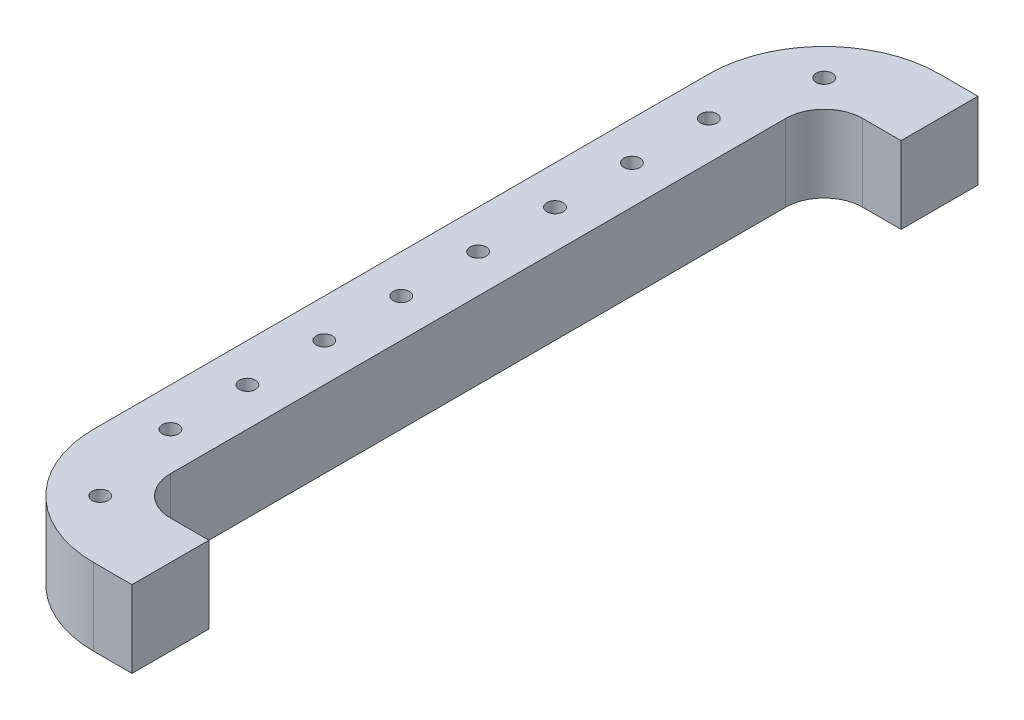
ISO-10303-21;
HEADER;
FILE_DESCRIPTION(('STEP AP214'),'2;1');
FILE_NAME('part.step','',(''),(''),'','','');
FILE_SCHEMA(('AUTOMOTIVE_DESIGN { 1 0 10303 214 1 1 1 1 }'));
ENDSEC;
DATA;
#1=APPLICATION_CONTEXT('core data for automotive mechanical design processes');
#2=APPLICATION_PROTOCOL_DEFINITION('international standard','automotive_design',2000,#1);
#3=PRODUCT_CONTEXT('',#1,'mechanical');
#4=PRODUCT('Part','Part','',(#3));
#5=PRODUCT_RELATED_PRODUCT_CATEGORY('part','',(#4));
#6=PRODUCT_DEFINITION_FORMATION('','',#4);
#7=PRODUCT_DEFINITION_CONTEXT('part definition',#1,'design');
#8=PRODUCT_DEFINITION('design','',#6,#7);
#9=PRODUCT_DEFINITION_SHAPE('','',#8);
#10=(LENGTH_UNIT() NAMED_UNIT(*) SI_UNIT(.MILLI.,.METRE.));
#11=(NAMED_UNIT(*) PLANE_ANGLE_UNIT() SI_UNIT($,.RADIAN.));
#12=(NAMED_UNIT(*) SI_UNIT($,.STERADIAN.) SOLID_ANGLE_UNIT());
#13=UNCERTAINTY_MEASURE_WITH_UNIT(LENGTH_MEASURE(1.E-05),#10,'distance_accuracy_value','');
#14=(GEOMETRIC_REPRESENTATION_CONTEXT(3) GLOBAL_UNCERTAINTY_ASSIGNED_CONTEXT((#13)) GLOBAL_UNIT_ASSIGNED_CONTEXT((#10,
#11,#12)) REPRESENTATION_CONTEXT('',''));
#15=CARTESIAN_POINT('',(0.,0.,0.));
#16=DIRECTION('',(0.,0.,1.));
#17=DIRECTION('',(1.,0.,0.));
#18=AXIS2_PLACEMENT_3D('',#15,#16,#17);
#19=CARTESIAN_POINT('',(10.,10.,0.));
#20=DIRECTION('',(-1.,0.,0.));
#21=DIRECTION('',(0.,0.,1.));
#22=AXIS2_PLACEMENT_3D('',#19,#20,#21);
#23=PLANE('',#22);
#24=DIRECTION('',(0.,0.,-1.));
#25=VECTOR('',#24,1.);
#26=CARTESIAN_POINT('',(10.,-10.,0.));
#27=LINE('',#26,#25);
#28=CARTESIAN_POINT('',(10.,-10.,150.));
#29=VERTEX_POINT('',#28);
#30=CARTESIAN_POINT('',(10.,-10.,-10.));
#31=VERTEX_POINT('',#30);
#32=EDGE_CURVE('E125',#29,#31,#27,.T.);
#33=ORIENTED_EDGE('',*,*,#32,.T.);
#34=DIRECTION('',(0.,-1.,0.));
#35=VECTOR('',#34,1.);
#36=CARTESIAN_POINT('',(10.,10.,-10.));
#37=LINE('',#36,#35);
#38=CARTESIAN_POINT('',(10.,10.,-10.));
#39=VERTEX_POINT('',#38);
#40=EDGE_CURVE('E11',#39,#31,#37,.T.);
#41=ORIENTED_EDGE('',*,*,#40,.F.);
#42=DIRECTION('',(0.,0.,-1.));
#43=VECTOR('',#42,1.);
#44=CARTESIAN_POINT('',(10.,10.,0.));
#45=LINE('',#44,#43);
#46=CARTESIAN_POINT('',(10.,10.,150.));
#47=VERTEX_POINT('',#46);
#48=EDGE_CURVE('E87',#47,#39,#45,.T.);
#49=ORIENTED_EDGE('',*,*,#48,.F.);
#50=DIRECTION('',(0.,-1.,0.));
#51=VECTOR('',#50,1.);
#52=CARTESIAN_POINT('',(10.,10.,150.));
#53=LINE('',#52,#51);
#54=EDGE_CURVE('E189',#47,#29,#53,.T.);
#55=ORIENTED_EDGE('',*,*,#54,.T.);
#56=EDGE_LOOP('',(#33,#41,#49,#55));
#57=FACE_BOUND('',#56,.T.);
#58=ADVANCED_FACE('F33',(#57),#23,.F.);
#59=CARTESIAN_POINT('',(20.,10.,-10.));
#60=DIRECTION('',(0.,-1.,0.));
#61=DIRECTION('',(0.,0.,-1.));
#62=AXIS2_PLACEMENT_3D('',#59,#60,#61);
#63=CYLINDRICAL_SURFACE('',#62,10.);
#64=CARTESIAN_POINT('',(20.,-10.,-10.));
#65=DIRECTION('',(0.,-1.,0.));
#66=DIRECTION('',(0.,0.,-1.));
#67=AXIS2_PLACEMENT_3D('',#64,#65,#66);
#68=CIRCLE('',#67,10.);
#69=CARTESIAN_POINT('',(20.,-10.,-20.));
#70=VERTEX_POINT('',#69);
#71=EDGE_CURVE('E127',#31,#70,#68,.T.);
#72=ORIENTED_EDGE('',*,*,#71,.T.);
#73=DIRECTION('',(0.,-1.,0.));
#74=VECTOR('',#73,1.);
#75=CARTESIAN_POINT('',(20.,10.,-20.));
#76=LINE('',#75,#74);
#77=CARTESIAN_POINT('',(20.,10.,-20.));
#78=VERTEX_POINT('',#77);
#79=EDGE_CURVE('E41',#78,#70,#76,.T.);
#80=ORIENTED_EDGE('',*,*,#79,.F.);
#81=CARTESIAN_POINT('',(20.,10.,-10.));
#82=DIRECTION('',(0.,-1.,0.));
#83=DIRECTION('',(0.,0.,-1.));
#84=AXIS2_PLACEMENT_3D('',#81,#82,#83);
#85=CIRCLE('',#84,10.);
#86=EDGE_CURVE('E222',#39,#78,#85,.T.);
#87=ORIENTED_EDGE('',*,*,#86,.F.);
#88=ORIENTED_EDGE('',*,*,#40,.T.);
#89=EDGE_LOOP('',(#72,#80,#87,#88));
#90=FACE_BOUND('',#89,.T.);
#91=ADVANCED_FACE('F223',(#90),#63,.F.);
#92=CARTESIAN_POINT('',(20.,10.,-20.));
#93=DIRECTION('',(0.,0.,-1.));
#94=DIRECTION('',(-1.,0.,0.));
#95=AXIS2_PLACEMENT_3D('',#92,#93,#94);
#96=PLANE('',#95);
#97=DIRECTION('',(1.,0.,0.));
#98=VECTOR('',#97,1.);
#99=CARTESIAN_POINT('',(20.,-10.,-20.));
#100=LINE('',#99,#98);
#101=CARTESIAN_POINT('',(30.,-10.,-20.));
#102=VERTEX_POINT('',#101);
#103=EDGE_CURVE('E130',#70,#102,#100,.T.);
#104=ORIENTED_EDGE('',*,*,#103,.T.);
#105=DIRECTION('',(0.,-1.,0.));
#106=VECTOR('',#105,1.);
#107=CARTESIAN_POINT('',(30.,10.,-20.));
#108=LINE('',#107,#106);
#109=CARTESIAN_POINT('',(30.,10.,-20.));
#110=VERTEX_POINT('',#109);
#111=EDGE_CURVE('E114',#110,#102,#108,.T.);
#112=ORIENTED_EDGE('',*,*,#111,.F.);
#113=DIRECTION('',(1.,0.,0.));
#114=VECTOR('',#113,1.);
#115=CARTESIAN_POINT('',(20.,10.,-20.));
#116=LINE('',#115,#114);
#117=EDGE_CURVE('E105',#78,#110,#116,.T.);
#118=ORIENTED_EDGE('',*,*,#117,.F.);
#119=ORIENTED_EDGE('',*,*,#79,.T.);
#120=EDGE_LOOP('',(#104,#112,#118,#119));
#121=FACE_BOUND('',#120,.T.);
#122=ADVANCED_FACE('F144',(#121),#96,.F.);
#123=CARTESIAN_POINT('',(30.,10.,-20.));
#124=DIRECTION('',(-1.,0.,0.));
#125=DIRECTION('',(0.,0.,1.));
#126=AXIS2_PLACEMENT_3D('',#123,#124,#125);
#127=PLANE('',#126);
#128=DIRECTION('',(0.,0.,-1.));
#129=VECTOR('',#128,1.);
#130=CARTESIAN_POINT('',(30.,-10.,-20.));
#131=LINE('',#130,#129);
#132=CARTESIAN_POINT('',(30.,-10.,-40.));
#133=VERTEX_POINT('',#132);
#134=EDGE_CURVE('E113',#102,#133,#131,.T.);
#135=ORIENTED_EDGE('',*,*,#134,.T.);
#136=DIRECTION('',(0.,-1.,0.));
#137=VECTOR('',#136,1.);
#138=CARTESIAN_POINT('',(30.,10.,-40.));
#139=LINE('',#138,#137);
#140=CARTESIAN_POINT('',(30.,10.,-40.));
#141=VERTEX_POINT('',#140);
#142=EDGE_CURVE('E110',#141,#133,#139,.T.);
#143=ORIENTED_EDGE('',*,*,#142,.F.);
#144=DIRECTION('',(0.,0.,-1.));
#145=VECTOR('',#144,1.);
#146=CARTESIAN_POINT('',(30.,10.,-20.));
#147=LINE('',#146,#145);
#148=EDGE_CURVE('E98',#110,#141,#147,.T.);
#149=ORIENTED_EDGE('',*,*,#148,.F.);
#150=ORIENTED_EDGE('',*,*,#111,.T.);
#151=EDGE_LOOP('',(#135,#143,#149,#150));
#152=FACE_BOUND('',#151,.T.);
#153=ADVANCED_FACE('F111',(#152),#127,.F.);
#154=CARTESIAN_POINT('',(20.,10.,-40.));
#155=DIRECTION('',(0.,0.,1.));
#156=DIRECTION('',(1.,0.,0.));
#157=AXIS2_PLACEMENT_3D('',#154,#155,#156);
#158=PLANE('',#157);
#159=DIRECTION('',(-1.,0.,0.));
#160=VECTOR('',#159,1.);
#161=CARTESIAN_POINT('',(20.,-10.,-40.));
#162=LINE('',#161,#160);
#163=CARTESIAN_POINT('',(20.,-10.,-40.));
#164=VERTEX_POINT('',#163);
#165=EDGE_CURVE('E73',#133,#164,#162,.T.);
#166=ORIENTED_EDGE('',*,*,#165,.T.);
#167=DIRECTION('',(0.,-1.,0.));
#168=VECTOR('',#167,1.);
#169=CARTESIAN_POINT('',(20.,10.,-40.));
#170=LINE('',#169,#168);
#171=CARTESIAN_POINT('',(20.,10.,-40.));
#172=VERTEX_POINT('',#171);
#173=EDGE_CURVE('E115',#172,#164,#170,.T.);
#174=ORIENTED_EDGE('',*,*,#173,.F.);
#175=DIRECTION('',(-1.,0.,0.));
#176=VECTOR('',#175,1.);
#177=CARTESIAN_POINT('',(20.,10.,-40.));
#178=LINE('',#177,#176);
#179=EDGE_CURVE('E103',#141,#172,#178,.T.);
#180=ORIENTED_EDGE('',*,*,#179,.F.);
#181=ORIENTED_EDGE('',*,*,#142,.T.);
#182=EDGE_LOOP('',(#166,#174,#180,#181));
#183=FACE_BOUND('',#182,.T.);
#184=ADVANCED_FACE('F117',(#183),#158,.F.);
#185=CARTESIAN_POINT('',(20.,10.,-10.));
#186=DIRECTION('',(0.,-1.,0.));
#187=DIRECTION('',(0.,0.,-1.));
#188=AXIS2_PLACEMENT_3D('',#185,#186,#187);
#189=CYLINDRICAL_SURFACE('',#188,30.);
#190=CARTESIAN_POINT('',(20.,-10.,-10.));
#191=DIRECTION('',(0.,1.,0.));
#192=DIRECTION('',(0.,0.,-1.));
#193=AXIS2_PLACEMENT_3D('',#190,#191,#192);
#194=CIRCLE('',#193,30.);
#195=CARTESIAN_POINT('',(-10.,-10.,-9.99999999999999));
#196=VERTEX_POINT('',#195);
#197=EDGE_CURVE('E79',#164,#196,#194,.T.);
#198=ORIENTED_EDGE('',*,*,#197,.T.);
#199=DIRECTION('',(0.,-1.,0.));
#200=VECTOR('',#199,1.);
#201=CARTESIAN_POINT('',(-10.,10.,-9.99999999999999));
#202=LINE('',#201,#200);
#203=CARTESIAN_POINT('',(-10.,10.,-9.99999999999999));
#204=VERTEX_POINT('',#203);
#205=EDGE_CURVE('E124',#204,#196,#202,.T.);
#206=ORIENTED_EDGE('',*,*,#205,.F.);
#207=CARTESIAN_POINT('',(20.,10.,-10.));
#208=DIRECTION('',(0.,1.,0.));
#209=DIRECTION('',(0.,0.,-1.));
#210=AXIS2_PLACEMENT_3D('',#207,#208,#209);
#211=CIRCLE('',#210,30.);
#212=EDGE_CURVE('E49',#172,#204,#211,.T.);
#213=ORIENTED_EDGE('',*,*,#212,.F.);
#214=ORIENTED_EDGE('',*,*,#173,.T.);
#215=EDGE_LOOP('',(#198,#206,#213,#214));
#216=FACE_BOUND('',#215,.T.);
#217=ADVANCED_FACE('F310',(#216),#189,.T.);
#218=CARTESIAN_POINT('',(-10.,10.,0.));
#219=DIRECTION('',(1.,0.,0.));
#220=DIRECTION('',(0.,0.,-1.));
#221=AXIS2_PLACEMENT_3D('',#218,#219,#220);
#222=PLANE('',#221);
#223=DIRECTION('',(0.,0.,1.));
#224=VECTOR('',#223,1.);
#225=CARTESIAN_POINT('',(-10.,-10.,0.));
#226=LINE('',#225,#224);
#227=CARTESIAN_POINT('',(-10.,-10.,150.));
#228=VERTEX_POINT('',#227);
#229=EDGE_CURVE('E135',#196,#228,#226,.T.);
#230=ORIENTED_EDGE('',*,*,#229,.T.);
#231=DIRECTION('',(0.,-1.,0.));
#232=VECTOR('',#231,1.);
#233=CARTESIAN_POINT('',(-10.,10.,150.));
#234=LINE('',#233,#232);
#235=CARTESIAN_POINT('',(-10.,10.,150.));
#236=VERTEX_POINT('',#235);
#237=EDGE_CURVE('E162',#236,#228,#234,.T.);
#238=ORIENTED_EDGE('',*,*,#237,.F.);
#239=DIRECTION('',(0.,0.,1.));
#240=VECTOR('',#239,1.);
#241=CARTESIAN_POINT('',(-10.,10.,0.));
#242=LINE('',#241,#240);
#243=EDGE_CURVE('E119',#204,#236,#242,.T.);
#244=ORIENTED_EDGE('',*,*,#243,.F.);
#245=ORIENTED_EDGE('',*,*,#205,.T.);
#246=EDGE_LOOP('',(#230,#238,#244,#245));
#247=FACE_BOUND('',#246,.T.);
#248=ADVANCED_FACE('F160',(#247),#222,.F.);
#249=CARTESIAN_POINT('',(20.,10.,-10.));
#250=DIRECTION('',(0.,-1.,0.));
#251=DIRECTION('',(0.,0.,-1.));
#252=AXIS2_PLACEMENT_3D('',#249,#250,#251);
#253=PLANE('',#252);
#254=CARTESIAN_POINT('',(0.,10.,20.));
#255=DIRECTION('',(0.,1.,0.));
#256=DIRECTION('',(0.,0.,1.));
#257=AXIS2_PLACEMENT_3D('',#254,#255,#256);
#258=CIRCLE('',#257,2.1);
#259=CARTESIAN_POINT('',(0.,10.,22.1));
#260=VERTEX_POINT('',#259);
#261=EDGE_CURVE('E196',#260,#260,#258,.T.);
#262=ORIENTED_EDGE('',*,*,#261,.F.);
#263=EDGE_LOOP('',(#262));
#264=FACE_BOUND('',#263,.T.);
#265=CARTESIAN_POINT('',(0.,10.,60.));
#266=DIRECTION('',(0.,1.,0.));
#267=DIRECTION('',(0.,0.,1.));
#268=AXIS2_PLACEMENT_3D('',#265,#266,#267);
#269=CIRCLE('',#268,2.1);
#270=CARTESIAN_POINT('',(0.,10.,62.1));
#271=VERTEX_POINT('',#270);
#272=EDGE_CURVE('E203',#271,#271,#269,.T.);
#273=ORIENTED_EDGE('',*,*,#272,.F.);
#274=EDGE_LOOP('',(#273));
#275=FACE_BOUND('',#274,.T.);
#276=CARTESIAN_POINT('',(0.,10.,40.));
#277=DIRECTION('',(0.,1.,0.));
#278=DIRECTION('',(0.,0.,1.));
#279=AXIS2_PLACEMENT_3D('',#276,#277,#278);
#280=CIRCLE('',#279,2.1);
#281=CARTESIAN_POINT('',(0.,10.,42.1));
#282=VERTEX_POINT('',#281);
#283=EDGE_CURVE('E202',#282,#282,#280,.T.);
#284=ORIENTED_EDGE('',*,*,#283,.F.);
#285=EDGE_LOOP('',(#284));
#286=FACE_BOUND('',#285,.T.);
#287=CARTESIAN_POINT('',(0.,10.,0.));
#288=DIRECTION('',(0.,1.,0.));
#289=DIRECTION('',(0.,0.,1.));
#290=AXIS2_PLACEMENT_3D('',#287,#288,#289);
#291=CIRCLE('',#290,2.1);
#292=CARTESIAN_POINT('',(0.,10.,2.1));
#293=VERTEX_POINT('',#292);
#294=EDGE_CURVE('E192',#293,#293,#291,.T.);
#295=ORIENTED_EDGE('',*,*,#294,.F.);
#296=EDGE_LOOP('',(#295));
#297=FACE_BOUND('',#296,.T.);
#298=CARTESIAN_POINT('',(5.85786437626905,10.,-24.1421356237309));
#299=DIRECTION('',(0.,1.,0.));
#300=DIRECTION('',(0.,0.,1.));
#301=AXIS2_PLACEMENT_3D('',#298,#299,#300);
#302=CIRCLE('',#301,2.1);
#303=CARTESIAN_POINT('',(5.85786437626905,10.,-22.0421356237309));
#304=VERTEX_POINT('',#303);
#305=EDGE_CURVE('E214',#304,#304,#302,.T.);
#306=ORIENTED_EDGE('',*,*,#305,.F.);
#307=EDGE_LOOP('',(#306));
#308=FACE_BOUND('',#307,.T.);
#309=ORIENTED_EDGE('',*,*,#243,.T.);
#310=CARTESIAN_POINT('',(20.,10.,150.));
#311=DIRECTION('',(0.,-1.,0.));
#312=DIRECTION('',(0.,0.,1.));
#313=AXIS2_PLACEMENT_3D('',#310,#311,#312);
#314=CIRCLE('',#313,30.);
#315=CARTESIAN_POINT('',(20.,10.,180.));
#316=VERTEX_POINT('',#315);
#317=EDGE_CURVE('E171',#316,#236,#314,.T.);
#318=ORIENTED_EDGE('',*,*,#317,.F.);
#319=DIRECTION('',(-1.,0.,0.));
#320=VECTOR('',#319,1.);
#321=CARTESIAN_POINT('',(20.,10.,180.));
#322=LINE('',#321,#320);
#323=CARTESIAN_POINT('',(30.,10.,180.));
#324=VERTEX_POINT('',#323);
#325=EDGE_CURVE('E176',#324,#316,#322,.T.);
#326=ORIENTED_EDGE('',*,*,#325,.F.);
#327=DIRECTION('',(0.,0.,1.));
#328=VECTOR('',#327,1.);
#329=CARTESIAN_POINT('',(30.,10.,160.));
#330=LINE('',#329,#328);
#331=CARTESIAN_POINT('',(30.,10.,160.));
#332=VERTEX_POINT('',#331);
#333=EDGE_CURVE('E255',#332,#324,#330,.T.);
#334=ORIENTED_EDGE('',*,*,#333,.F.);
#335=DIRECTION('',(1.,0.,0.));
#336=VECTOR('',#335,1.);
#337=CARTESIAN_POINT('',(20.,10.,160.));
#338=LINE('',#337,#336);
#339=CARTESIAN_POINT('',(20.,10.,160.));
#340=VERTEX_POINT('',#339);
#341=EDGE_CURVE('E251',#340,#332,#338,.T.);
#342=ORIENTED_EDGE('',*,*,#341,.F.);
#343=CARTESIAN_POINT('',(20.,10.,150.));
#344=DIRECTION('',(0.,1.,0.));
#345=DIRECTION('',(0.,0.,1.));
#346=AXIS2_PLACEMENT_3D('',#343,#344,#345);
#347=CIRCLE('',#346,10.);
#348=EDGE_CURVE('E250',#47,#340,#347,.T.);
#349=ORIENTED_EDGE('',*,*,#348,.F.);
#350=ORIENTED_EDGE('',*,*,#48,.T.);
#351=ORIENTED_EDGE('',*,*,#86,.T.);
#352=ORIENTED_EDGE('',*,*,#117,.T.);
#353=ORIENTED_EDGE('',*,*,#148,.T.);
#354=ORIENTED_EDGE('',*,*,#179,.T.);
#355=ORIENTED_EDGE('',*,*,#212,.T.);
#356=EDGE_LOOP('',(#309,#318,#326,#334,#342,#349,#350,#351,#352,#353,#354,#355));
#357=FACE_BOUND('',#356,.T.);
#358=CARTESIAN_POINT('',(0.,10.,120.));
#359=DIRECTION('',(0.,-1.,0.));
#360=DIRECTION('',(0.,0.,-1.));
#361=AXIS2_PLACEMENT_3D('',#358,#359,#360);
#362=CIRCLE('',#361,2.1);
#363=CARTESIAN_POINT('',(0.,10.,117.9));
#364=VERTEX_POINT('',#363);
#365=EDGE_CURVE('E464',#364,#364,#362,.T.);
#366=ORIENTED_EDGE('',*,*,#365,.T.);
#367=EDGE_LOOP('',(#366));
#368=FACE_BOUND('',#367,.T.);
#369=CARTESIAN_POINT('',(0.,10.,80.));
#370=DIRECTION('',(0.,-1.,0.));
#371=DIRECTION('',(0.,0.,-1.));
#372=AXIS2_PLACEMENT_3D('',#369,#370,#371);
#373=CIRCLE('',#372,2.1);
#374=CARTESIAN_POINT('',(0.,10.,77.9));
#375=VERTEX_POINT('',#374);
#376=EDGE_CURVE('E467',#375,#375,#373,.T.);
#377=ORIENTED_EDGE('',*,*,#376,.T.);
#378=EDGE_LOOP('',(#377));
#379=FACE_BOUND('',#378,.T.);
#380=CARTESIAN_POINT('',(0.,10.,100.));
#381=DIRECTION('',(0.,-1.,0.));
#382=DIRECTION('',(0.,0.,-1.));
#383=AXIS2_PLACEMENT_3D('',#380,#381,#382);
#384=CIRCLE('',#383,2.1);
#385=CARTESIAN_POINT('',(0.,10.,97.9));
#386=VERTEX_POINT('',#385);
#387=EDGE_CURVE('E477',#386,#386,#384,.T.);
#388=ORIENTED_EDGE('',*,*,#387,.T.);
#389=EDGE_LOOP('',(#388));
#390=FACE_BOUND('',#389,.T.);
#391=CARTESIAN_POINT('',(0.,10.,140.));
#392=DIRECTION('',(0.,-1.,0.));
#393=DIRECTION('',(0.,0.,-1.));
#394=AXIS2_PLACEMENT_3D('',#391,#392,#393);
#395=CIRCLE('',#394,2.1);
#396=CARTESIAN_POINT('',(0.,10.,137.9));
#397=VERTEX_POINT('',#396);
#398=EDGE_CURVE('E470',#397,#397,#395,.T.);
#399=ORIENTED_EDGE('',*,*,#398,.T.);
#400=EDGE_LOOP('',(#399));
#401=FACE_BOUND('',#400,.T.);
#402=CARTESIAN_POINT('',(5.85786437626905,10.,164.142135623731));
#403=DIRECTION('',(0.,-1.,0.));
#404=DIRECTION('',(0.,0.,-1.));
#405=AXIS2_PLACEMENT_3D('',#402,#403,#404);
#406=CIRCLE('',#405,2.1);
#407=CARTESIAN_POINT('',(5.85786437626905,10.,162.042135623731));
#408=VERTEX_POINT('',#407);
#409=EDGE_CURVE('E243',#408,#408,#406,.T.);
#410=ORIENTED_EDGE('',*,*,#409,.T.);
#411=EDGE_LOOP('',(#410));
#412=FACE_BOUND('',#411,.T.);
#413=ADVANCED_FACE('F100',(#264,#275,#286,#297,#308,#357,#368,#379,#390,#401,#412),#253,.F.);
#414=CARTESIAN_POINT('',(20.,-10.,-10.));
#415=DIRECTION('',(0.,-1.,0.));
#416=DIRECTION('',(0.,0.,-1.));
#417=AXIS2_PLACEMENT_3D('',#414,#415,#416);
#418=PLANE('',#417);
#419=CARTESIAN_POINT('',(0.,-10.,20.));
#420=DIRECTION('',(0.,1.,0.));
#421=DIRECTION('',(0.,0.,1.));
#422=AXIS2_PLACEMENT_3D('',#419,#420,#421);
#423=CIRCLE('',#422,2.1);
#424=CARTESIAN_POINT('',(0.,-10.,22.1));
#425=VERTEX_POINT('',#424);
#426=EDGE_CURVE('E206',#425,#425,#423,.T.);
#427=ORIENTED_EDGE('',*,*,#426,.T.);
#428=EDGE_LOOP('',(#427));
#429=FACE_BOUND('',#428,.T.);
#430=CARTESIAN_POINT('',(0.,-10.,60.));
#431=DIRECTION('',(0.,1.,0.));
#432=DIRECTION('',(0.,0.,1.));
#433=AXIS2_PLACEMENT_3D('',#430,#431,#432);
#434=CIRCLE('',#433,2.1);
#435=CARTESIAN_POINT('',(0.,-10.,62.1));
#436=VERTEX_POINT('',#435);
#437=EDGE_CURVE('E199',#436,#436,#434,.T.);
#438=ORIENTED_EDGE('',*,*,#437,.T.);
#439=EDGE_LOOP('',(#438));
#440=FACE_BOUND('',#439,.T.);
#441=CARTESIAN_POINT('',(0.,-10.,40.));
#442=DIRECTION('',(0.,1.,0.));
#443=DIRECTION('',(0.,0.,1.));
#444=AXIS2_PLACEMENT_3D('',#441,#442,#443);
#445=CIRCLE('',#444,2.1);
#446=CARTESIAN_POINT('',(0.,-10.,42.1));
#447=VERTEX_POINT('',#446);
#448=EDGE_CURVE('E211',#447,#447,#445,.T.);
#449=ORIENTED_EDGE('',*,*,#448,.T.);
#450=EDGE_LOOP('',(#449));
#451=FACE_BOUND('',#450,.T.);
#452=CARTESIAN_POINT('',(0.,-10.,0.));
#453=DIRECTION('',(0.,1.,0.));
#454=DIRECTION('',(0.,0.,1.));
#455=AXIS2_PLACEMENT_3D('',#452,#453,#454);
#456=CIRCLE('',#455,2.1);
#457=CARTESIAN_POINT('',(0.,-10.,2.1));
#458=VERTEX_POINT('',#457);
#459=EDGE_CURVE('E193',#458,#458,#456,.T.);
#460=ORIENTED_EDGE('',*,*,#459,.T.);
#461=EDGE_LOOP('',(#460));
#462=FACE_BOUND('',#461,.T.);
#463=CARTESIAN_POINT('',(5.85786437626905,-10.,-24.1421356237309));
#464=DIRECTION('',(0.,1.,0.));
#465=DIRECTION('',(0.,0.,1.));
#466=AXIS2_PLACEMENT_3D('',#463,#464,#465);
#467=CIRCLE('',#466,2.1);
#468=CARTESIAN_POINT('',(5.85786437626905,-10.,-22.0421356237309));
#469=VERTEX_POINT('',#468);
#470=EDGE_CURVE('E128',#469,#469,#467,.T.);
#471=ORIENTED_EDGE('',*,*,#470,.T.);
#472=EDGE_LOOP('',(#471));
#473=FACE_BOUND('',#472,.T.);
#474=ORIENTED_EDGE('',*,*,#32,.F.);
#475=CARTESIAN_POINT('',(20.,-10.,150.));
#476=DIRECTION('',(0.,1.,0.));
#477=DIRECTION('',(0.,0.,1.));
#478=AXIS2_PLACEMENT_3D('',#475,#476,#477);
#479=CIRCLE('',#478,10.);
#480=CARTESIAN_POINT('',(20.,-10.,160.));
#481=VERTEX_POINT('',#480);
#482=EDGE_CURVE('E231',#29,#481,#479,.T.);
#483=ORIENTED_EDGE('',*,*,#482,.T.);
#484=DIRECTION('',(1.,0.,0.));
#485=VECTOR('',#484,1.);
#486=CARTESIAN_POINT('',(20.,-10.,160.));
#487=LINE('',#486,#485);
#488=CARTESIAN_POINT('',(30.,-10.,160.));
#489=VERTEX_POINT('',#488);
#490=EDGE_CURVE('E237',#481,#489,#487,.T.);
#491=ORIENTED_EDGE('',*,*,#490,.T.);
#492=DIRECTION('',(0.,0.,1.));
#493=VECTOR('',#492,1.);
#494=CARTESIAN_POINT('',(30.,-10.,160.));
#495=LINE('',#494,#493);
#496=CARTESIAN_POINT('',(30.,-10.,180.));
#497=VERTEX_POINT('',#496);
#498=EDGE_CURVE('E240',#489,#497,#495,.T.);
#499=ORIENTED_EDGE('',*,*,#498,.T.);
#500=DIRECTION('',(-1.,0.,0.));
#501=VECTOR('',#500,1.);
#502=CARTESIAN_POINT('',(20.,-10.,180.));
#503=LINE('',#502,#501);
#504=CARTESIAN_POINT('',(20.,-10.,180.));
#505=VERTEX_POINT('',#504);
#506=EDGE_CURVE('E248',#497,#505,#503,.T.);
#507=ORIENTED_EDGE('',*,*,#506,.T.);
#508=CARTESIAN_POINT('',(20.,-10.,150.));
#509=DIRECTION('',(0.,-1.,0.));
#510=DIRECTION('',(0.,0.,1.));
#511=AXIS2_PLACEMENT_3D('',#508,#509,#510);
#512=CIRCLE('',#511,30.);
#513=EDGE_CURVE('E156',#505,#228,#512,.T.);
#514=ORIENTED_EDGE('',*,*,#513,.T.);
#515=ORIENTED_EDGE('',*,*,#229,.F.);
#516=ORIENTED_EDGE('',*,*,#197,.F.);
#517=ORIENTED_EDGE('',*,*,#165,.F.);
#518=ORIENTED_EDGE('',*,*,#134,.F.);
#519=ORIENTED_EDGE('',*,*,#103,.F.);
#520=ORIENTED_EDGE('',*,*,#71,.F.);
#521=EDGE_LOOP('',(#474,#483,#491,#499,#507,#514,#515,#516,#517,#518,#519,#520));
#522=FACE_BOUND('',#521,.T.);
#523=CARTESIAN_POINT('',(0.,-10.,120.));
#524=DIRECTION('',(0.,-1.,0.));
#525=DIRECTION('',(0.,0.,-1.));
#526=AXIS2_PLACEMENT_3D('',#523,#524,#525);
#527=CIRCLE('',#526,2.1);
#528=CARTESIAN_POINT('',(0.,-10.,117.9));
#529=VERTEX_POINT('',#528);
#530=EDGE_CURVE('E461',#529,#529,#527,.T.);
#531=ORIENTED_EDGE('',*,*,#530,.F.);
#532=EDGE_LOOP('',(#531));
#533=FACE_BOUND('',#532,.T.);
#534=CARTESIAN_POINT('',(0.,-10.,80.));
#535=DIRECTION('',(0.,-1.,0.));
#536=DIRECTION('',(0.,0.,-1.));
#537=AXIS2_PLACEMENT_3D('',#534,#535,#536);
#538=CIRCLE('',#537,2.1);
#539=CARTESIAN_POINT('',(0.,-10.,77.9));
#540=VERTEX_POINT('',#539);
#541=EDGE_CURVE('E479',#540,#540,#538,.T.);
#542=ORIENTED_EDGE('',*,*,#541,.F.);
#543=EDGE_LOOP('',(#542));
#544=FACE_BOUND('',#543,.T.);
#545=CARTESIAN_POINT('',(0.,-10.,100.));
#546=DIRECTION('',(0.,-1.,0.));
#547=DIRECTION('',(0.,0.,-1.));
#548=AXIS2_PLACEMENT_3D('',#545,#546,#547);
#549=CIRCLE('',#548,2.1);
#550=CARTESIAN_POINT('',(0.,-10.,97.9));
#551=VERTEX_POINT('',#550);
#552=EDGE_CURVE('E474',#551,#551,#549,.T.);
#553=ORIENTED_EDGE('',*,*,#552,.F.);
#554=EDGE_LOOP('',(#553));
#555=FACE_BOUND('',#554,.T.);
#556=CARTESIAN_POINT('',(0.,-10.,140.));
#557=DIRECTION('',(0.,-1.,0.));
#558=DIRECTION('',(0.,0.,-1.));
#559=AXIS2_PLACEMENT_3D('',#556,#557,#558);
#560=CIRCLE('',#559,2.1);
#561=CARTESIAN_POINT('',(0.,-10.,137.9));
#562=VERTEX_POINT('',#561);
#563=EDGE_CURVE('E465',#562,#562,#560,.T.);
#564=ORIENTED_EDGE('',*,*,#563,.F.);
#565=EDGE_LOOP('',(#564));
#566=FACE_BOUND('',#565,.T.);
#567=CARTESIAN_POINT('',(5.85786437626905,-10.,164.142135623731));
#568=DIRECTION('',(0.,-1.,0.));
#569=DIRECTION('',(0.,0.,-1.));
#570=AXIS2_PLACEMENT_3D('',#567,#568,#569);
#571=CIRCLE('',#570,2.1);
#572=CARTESIAN_POINT('',(5.85786437626905,-10.,162.042135623731));
#573=VERTEX_POINT('',#572);
#574=EDGE_CURVE('E238',#573,#573,#571,.T.);
#575=ORIENTED_EDGE('',*,*,#574,.F.);
#576=EDGE_LOOP('',(#575));
#577=FACE_BOUND('',#576,.T.);
#578=ADVANCED_FACE('F150',(#429,#440,#451,#462,#473,#522,#533,#544,#555,#566,#577),#418,.T.);
#579=CARTESIAN_POINT('',(5.85786437626905,-10.,-24.1421356237309));
#580=DIRECTION('',(0.,1.,0.));
#581=DIRECTION('',(0.,0.,1.));
#582=AXIS2_PLACEMENT_3D('',#579,#580,#581);
#583=CYLINDRICAL_SURFACE('',#582,2.1);
#584=ORIENTED_EDGE('',*,*,#470,.F.);
#585=EDGE_LOOP('',(#584));
#586=FACE_BOUND('',#585,.T.);
#587=ORIENTED_EDGE('',*,*,#305,.T.);
#588=EDGE_LOOP('',(#587));
#589=FACE_BOUND('',#588,.T.);
#590=ADVANCED_FACE('F317',(#586,#589),#583,.F.);
#591=CARTESIAN_POINT('',(0.,-10.,0.));
#592=DIRECTION('',(0.,1.,0.));
#593=DIRECTION('',(0.,0.,1.));
#594=AXIS2_PLACEMENT_3D('',#591,#592,#593);
#595=CYLINDRICAL_SURFACE('',#594,2.1);
#596=ORIENTED_EDGE('',*,*,#459,.F.);
#597=EDGE_LOOP('',(#596));
#598=FACE_BOUND('',#597,.T.);
#599=ORIENTED_EDGE('',*,*,#294,.T.);
#600=EDGE_LOOP('',(#599));
#601=FACE_BOUND('',#600,.T.);
#602=ADVANCED_FACE('F324',(#598,#601),#595,.F.);
#603=CARTESIAN_POINT('',(0.,-10.,40.));
#604=DIRECTION('',(0.,1.,0.));
#605=DIRECTION('',(0.,0.,1.));
#606=AXIS2_PLACEMENT_3D('',#603,#604,#605);
#607=CYLINDRICAL_SURFACE('',#606,2.1);
#608=ORIENTED_EDGE('',*,*,#448,.F.);
#609=EDGE_LOOP('',(#608));
#610=FACE_BOUND('',#609,.T.);
#611=ORIENTED_EDGE('',*,*,#283,.T.);
#612=EDGE_LOOP('',(#611));
#613=FACE_BOUND('',#612,.T.);
#614=ADVANCED_FACE('F326',(#610,#613),#607,.F.);
#615=CARTESIAN_POINT('',(0.,-10.,60.));
#616=DIRECTION('',(0.,1.,0.));
#617=DIRECTION('',(0.,0.,1.));
#618=AXIS2_PLACEMENT_3D('',#615,#616,#617);
#619=CYLINDRICAL_SURFACE('',#618,2.1);
#620=ORIENTED_EDGE('',*,*,#437,.F.);
#621=EDGE_LOOP('',(#620));
#622=FACE_BOUND('',#621,.T.);
#623=ORIENTED_EDGE('',*,*,#272,.T.);
#624=EDGE_LOOP('',(#623));
#625=FACE_BOUND('',#624,.T.);
#626=ADVANCED_FACE('F329',(#622,#625),#619,.F.);
#627=CARTESIAN_POINT('',(0.,-10.,20.));
#628=DIRECTION('',(0.,1.,0.));
#629=DIRECTION('',(0.,0.,1.));
#630=AXIS2_PLACEMENT_3D('',#627,#628,#629);
#631=CYLINDRICAL_SURFACE('',#630,2.1);
#632=ORIENTED_EDGE('',*,*,#426,.F.);
#633=EDGE_LOOP('',(#632));
#634=FACE_BOUND('',#633,.T.);
#635=ORIENTED_EDGE('',*,*,#261,.T.);
#636=EDGE_LOOP('',(#635));
#637=FACE_BOUND('',#636,.T.);
#638=ADVANCED_FACE('F295',(#634,#637),#631,.F.);
#639=CARTESIAN_POINT('',(20.,10.,150.));
#640=DIRECTION('',(0.,-1.,0.));
#641=DIRECTION('',(0.,0.,1.));
#642=AXIS2_PLACEMENT_3D('',#639,#640,#641);
#643=CYLINDRICAL_SURFACE('',#642,10.);
#644=ORIENTED_EDGE('',*,*,#482,.F.);
#645=ORIENTED_EDGE('',*,*,#54,.F.);
#646=ORIENTED_EDGE('',*,*,#348,.T.);
#647=DIRECTION('',(0.,-1.,0.));
#648=VECTOR('',#647,1.);
#649=CARTESIAN_POINT('',(20.,10.,160.));
#650=LINE('',#649,#648);
#651=EDGE_CURVE('E186',#340,#481,#650,.T.);
#652=ORIENTED_EDGE('',*,*,#651,.T.);
#653=EDGE_LOOP('',(#644,#645,#646,#652));
#654=FACE_BOUND('',#653,.T.);
#655=ADVANCED_FACE('F234',(#654),#643,.F.);
#656=CARTESIAN_POINT('',(20.,10.,160.));
#657=DIRECTION('',(0.,0.,1.));
#658=DIRECTION('',(-1.,0.,0.));
#659=AXIS2_PLACEMENT_3D('',#656,#657,#658);
#660=PLANE('',#659);
#661=ORIENTED_EDGE('',*,*,#490,.F.);
#662=ORIENTED_EDGE('',*,*,#651,.F.);
#663=ORIENTED_EDGE('',*,*,#341,.T.);
#664=DIRECTION('',(0.,-1.,0.));
#665=VECTOR('',#664,1.);
#666=CARTESIAN_POINT('',(30.,10.,160.));
#667=LINE('',#666,#665);
#668=EDGE_CURVE('E183',#332,#489,#667,.T.);
#669=ORIENTED_EDGE('',*,*,#668,.T.);
#670=EDGE_LOOP('',(#661,#662,#663,#669));
#671=FACE_BOUND('',#670,.T.);
#672=ADVANCED_FACE('F286',(#671),#660,.F.);
#673=CARTESIAN_POINT('',(30.,10.,160.));
#674=DIRECTION('',(-1.,0.,0.));
#675=DIRECTION('',(0.,0.,-1.));
#676=AXIS2_PLACEMENT_3D('',#673,#674,#675);
#677=PLANE('',#676);
#678=ORIENTED_EDGE('',*,*,#498,.F.);
#679=ORIENTED_EDGE('',*,*,#668,.F.);
#680=ORIENTED_EDGE('',*,*,#333,.T.);
#681=DIRECTION('',(0.,-1.,0.));
#682=VECTOR('',#681,1.);
#683=CARTESIAN_POINT('',(30.,10.,180.));
#684=LINE('',#683,#682);
#685=EDGE_CURVE('E174',#324,#497,#684,.T.);
#686=ORIENTED_EDGE('',*,*,#685,.T.);
#687=EDGE_LOOP('',(#678,#679,#680,#686));
#688=FACE_BOUND('',#687,.T.);
#689=ADVANCED_FACE('F284',(#688),#677,.F.);
#690=CARTESIAN_POINT('',(20.,10.,180.));
#691=DIRECTION('',(0.,0.,-1.));
#692=DIRECTION('',(1.,0.,0.));
#693=AXIS2_PLACEMENT_3D('',#690,#691,#692);
#694=PLANE('',#693);
#695=ORIENTED_EDGE('',*,*,#506,.F.);
#696=ORIENTED_EDGE('',*,*,#685,.F.);
#697=ORIENTED_EDGE('',*,*,#325,.T.);
#698=DIRECTION('',(0.,-1.,0.));
#699=VECTOR('',#698,1.);
#700=CARTESIAN_POINT('',(20.,10.,180.));
#701=LINE('',#700,#699);
#702=EDGE_CURVE('E172',#316,#505,#701,.T.);
#703=ORIENTED_EDGE('',*,*,#702,.T.);
#704=EDGE_LOOP('',(#695,#696,#697,#703));
#705=FACE_BOUND('',#704,.T.);
#706=ADVANCED_FACE('F265',(#705),#694,.F.);
#707=CARTESIAN_POINT('',(20.,10.,150.));
#708=DIRECTION('',(0.,-1.,0.));
#709=DIRECTION('',(0.,0.,1.));
#710=AXIS2_PLACEMENT_3D('',#707,#708,#709);
#711=CYLINDRICAL_SURFACE('',#710,30.);
#712=ORIENTED_EDGE('',*,*,#513,.F.);
#713=ORIENTED_EDGE('',*,*,#702,.F.);
#714=ORIENTED_EDGE('',*,*,#317,.T.);
#715=ORIENTED_EDGE('',*,*,#237,.T.);
#716=EDGE_LOOP('',(#712,#713,#714,#715));
#717=FACE_BOUND('',#716,.T.);
#718=ADVANCED_FACE('F167',(#717),#711,.T.);
#719=CARTESIAN_POINT('',(5.85786437626905,-10.,164.142135623731));
#720=DIRECTION('',(0.,1.,0.));
#721=DIRECTION('',(0.,0.,-1.));
#722=AXIS2_PLACEMENT_3D('',#719,#720,#721);
#723=CYLINDRICAL_SURFACE('',#722,2.1);
#724=ORIENTED_EDGE('',*,*,#574,.T.);
#725=EDGE_LOOP('',(#724));
#726=FACE_BOUND('',#725,.T.);
#727=ORIENTED_EDGE('',*,*,#409,.F.);
#728=EDGE_LOOP('',(#727));
#729=FACE_BOUND('',#728,.T.);
#730=ADVANCED_FACE('F405',(#726,#729),#723,.F.);
#731=CARTESIAN_POINT('',(0.,-10.,140.));
#732=DIRECTION('',(0.,1.,0.));
#733=DIRECTION('',(0.,0.,-1.));
#734=AXIS2_PLACEMENT_3D('',#731,#732,#733);
#735=CYLINDRICAL_SURFACE('',#734,2.1);
#736=ORIENTED_EDGE('',*,*,#563,.T.);
#737=EDGE_LOOP('',(#736));
#738=FACE_BOUND('',#737,.T.);
#739=ORIENTED_EDGE('',*,*,#398,.F.);
#740=EDGE_LOOP('',(#739));
#741=FACE_BOUND('',#740,.T.);
#742=ADVANCED_FACE('F414',(#738,#741),#735,.F.);
#743=CARTESIAN_POINT('',(0.,-10.,100.));
#744=DIRECTION('',(0.,1.,0.));
#745=DIRECTION('',(0.,0.,-1.));
#746=AXIS2_PLACEMENT_3D('',#743,#744,#745);
#747=CYLINDRICAL_SURFACE('',#746,2.1);
#748=ORIENTED_EDGE('',*,*,#552,.T.);
#749=EDGE_LOOP('',(#748));
#750=FACE_BOUND('',#749,.T.);
#751=ORIENTED_EDGE('',*,*,#387,.F.);
#752=EDGE_LOOP('',(#751));
#753=FACE_BOUND('',#752,.T.);
#754=ADVANCED_FACE('F424',(#750,#753),#747,.F.);
#755=CARTESIAN_POINT('',(0.,-10.,80.));
#756=DIRECTION('',(0.,1.,0.));
#757=DIRECTION('',(0.,0.,-1.));
#758=AXIS2_PLACEMENT_3D('',#755,#756,#757);
#759=CYLINDRICAL_SURFACE('',#758,2.1);
#760=ORIENTED_EDGE('',*,*,#541,.T.);
#761=EDGE_LOOP('',(#760));
#762=FACE_BOUND('',#761,.T.);
#763=ORIENTED_EDGE('',*,*,#376,.F.);
#764=EDGE_LOOP('',(#763));
#765=FACE_BOUND('',#764,.T.);
#766=ADVANCED_FACE('F434',(#762,#765),#759,.F.);
#767=CARTESIAN_POINT('',(0.,-10.,120.));
#768=DIRECTION('',(0.,1.,0.));
#769=DIRECTION('',(0.,0.,-1.));
#770=AXIS2_PLACEMENT_3D('',#767,#768,#769);
#771=CYLINDRICAL_SURFACE('',#770,2.1);
#772=ORIENTED_EDGE('',*,*,#530,.T.);
#773=EDGE_LOOP('',(#772));
#774=FACE_BOUND('',#773,.T.);
#775=ORIENTED_EDGE('',*,*,#365,.F.);
#776=EDGE_LOOP('',(#775));
#777=FACE_BOUND('',#776,.T.);
#778=ADVANCED_FACE('F444',(#774,#777),#771,.F.);
#779=CLOSED_SHELL('',(#58,#91,#122,#153,#184,#217,#248,#413,#578,#590,#602,#614,#626,#638,#655,
#672,#689,#706,#718,#730,#742,#754,#766,#778));
#780=MANIFOLD_SOLID_BREP('B2',#779);
#781=ADVANCED_BREP_SHAPE_REPRESENTATION('',(#18,#780),#14);
#782=SHAPE_DEFINITION_REPRESENTATION(#9,#781);
ENDSEC;
END-ISO-10303-21;
